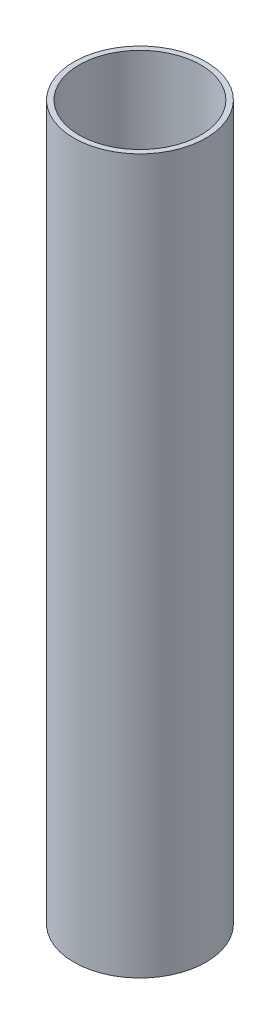
ISO-10303-21;
HEADER;
FILE_DESCRIPTION(('STEP AP214'),'2;1');
FILE_NAME('part.step','',(''),(''),'','','');
FILE_SCHEMA(('AUTOMOTIVE_DESIGN { 1 0 10303 214 1 1 1 1 }'));
ENDSEC;
DATA;
#1=APPLICATION_CONTEXT('core data for automotive mechanical design processes');
#2=APPLICATION_PROTOCOL_DEFINITION('international standard','automotive_design',2000,#1);
#3=PRODUCT_CONTEXT('',#1,'mechanical');
#4=PRODUCT('Part','Part','',(#3));
#5=PRODUCT_RELATED_PRODUCT_CATEGORY('part','',(#4));
#6=PRODUCT_DEFINITION_FORMATION('','',#4);
#7=PRODUCT_DEFINITION_CONTEXT('part definition',#1,'design');
#8=PRODUCT_DEFINITION('design','',#6,#7);
#9=PRODUCT_DEFINITION_SHAPE('','',#8);
#10=(LENGTH_UNIT() NAMED_UNIT(*) SI_UNIT(.MILLI.,.METRE.));
#11=(NAMED_UNIT(*) PLANE_ANGLE_UNIT() SI_UNIT($,.RADIAN.));
#12=(NAMED_UNIT(*) SI_UNIT($,.STERADIAN.) SOLID_ANGLE_UNIT());
#13=UNCERTAINTY_MEASURE_WITH_UNIT(LENGTH_MEASURE(1.E-05),#10,'distance_accuracy_value','');
#14=(GEOMETRIC_REPRESENTATION_CONTEXT(3) GLOBAL_UNCERTAINTY_ASSIGNED_CONTEXT((#13)) GLOBAL_UNIT_ASSIGNED_CONTEXT((#10,
#11,#12)) REPRESENTATION_CONTEXT('',''));
#15=CARTESIAN_POINT('',(0.,0.,0.));
#16=DIRECTION('',(0.,0.,1.));
#17=DIRECTION('',(1.,0.,0.));
#18=AXIS2_PLACEMENT_3D('',#15,#16,#17);
#19=CARTESIAN_POINT('',(0.,135.,0.));
#20=DIRECTION('',(0.,1.,0.));
#21=DIRECTION('',(0.,0.,1.));
#22=AXIS2_PLACEMENT_3D('',#19,#20,#21);
#23=PLANE('',#22);
#24=CARTESIAN_POINT('',(0.,135.,0.));
#25=DIRECTION('',(0.,1.,0.));
#26=DIRECTION('',(0.,0.,1.));
#27=AXIS2_PLACEMENT_3D('',#24,#25,#26);
#28=CIRCLE('',#27,12.5);
#29=CARTESIAN_POINT('',(0.,135.,12.5));
#30=VERTEX_POINT('',#29);
#31=EDGE_CURVE('E10',#30,#30,#28,.T.);
#32=ORIENTED_EDGE('',*,*,#31,.T.);
#33=EDGE_LOOP('',(#32));
#34=FACE_BOUND('',#33,.T.);
#35=CARTESIAN_POINT('',(0.,135.,0.));
#36=DIRECTION('',(0.,1.,0.));
#37=DIRECTION('',(0.,0.,1.));
#38=AXIS2_PLACEMENT_3D('',#35,#36,#37);
#39=CIRCLE('',#38,11.5);
#40=CARTESIAN_POINT('',(0.,135.,11.5));
#41=VERTEX_POINT('',#40);
#42=EDGE_CURVE('E44',#41,#41,#39,.T.);
#43=ORIENTED_EDGE('',*,*,#42,.F.);
#44=EDGE_LOOP('',(#43));
#45=FACE_BOUND('',#44,.T.);
#46=ADVANCED_FACE('F33',(#34,#45),#23,.T.);
#47=CARTESIAN_POINT('',(0.,0.,0.));
#48=DIRECTION('',(0.,1.,0.));
#49=DIRECTION('',(0.,0.,1.));
#50=AXIS2_PLACEMENT_3D('',#47,#48,#49);
#51=PLANE('',#50);
#52=CARTESIAN_POINT('',(0.,0.,0.));
#53=DIRECTION('',(0.,1.,0.));
#54=DIRECTION('',(0.,0.,1.));
#55=AXIS2_PLACEMENT_3D('',#52,#53,#54);
#56=CIRCLE('',#55,12.5);
#57=CARTESIAN_POINT('',(0.,0.,12.5));
#58=VERTEX_POINT('',#57);
#59=EDGE_CURVE('E37',#58,#58,#56,.T.);
#60=ORIENTED_EDGE('',*,*,#59,.F.);
#61=EDGE_LOOP('',(#60));
#62=FACE_BOUND('',#61,.T.);
#63=CARTESIAN_POINT('',(0.,0.,0.));
#64=DIRECTION('',(0.,1.,0.));
#65=DIRECTION('',(0.,0.,1.));
#66=AXIS2_PLACEMENT_3D('',#63,#64,#65);
#67=CIRCLE('',#66,11.5);
#68=CARTESIAN_POINT('',(0.,0.,11.5));
#69=VERTEX_POINT('',#68);
#70=EDGE_CURVE('E46',#69,#69,#67,.T.);
#71=ORIENTED_EDGE('',*,*,#70,.T.);
#72=EDGE_LOOP('',(#71));
#73=FACE_BOUND('',#72,.T.);
#74=ADVANCED_FACE('F56',(#62,#73),#51,.F.);
#75=CARTESIAN_POINT('',(0.,135.,0.));
#76=DIRECTION('',(0.,-1.,0.));
#77=DIRECTION('',(0.,0.,-1.));
#78=AXIS2_PLACEMENT_3D('',#75,#76,#77);
#79=CYLINDRICAL_SURFACE('',#78,12.5);
#80=ORIENTED_EDGE('',*,*,#31,.F.);
#81=EDGE_LOOP('',(#80));
#82=FACE_BOUND('',#81,.T.);
#83=ORIENTED_EDGE('',*,*,#59,.T.);
#84=EDGE_LOOP('',(#83));
#85=FACE_BOUND('',#84,.T.);
#86=ADVANCED_FACE('F35',(#82,#85),#79,.T.);
#87=CARTESIAN_POINT('',(0.,135.,0.));
#88=DIRECTION('',(0.,-1.,0.));
#89=DIRECTION('',(0.,0.,-1.));
#90=AXIS2_PLACEMENT_3D('',#87,#88,#89);
#91=CYLINDRICAL_SURFACE('',#90,11.5);
#92=ORIENTED_EDGE('',*,*,#42,.T.);
#93=EDGE_LOOP('',(#92));
#94=FACE_BOUND('',#93,.T.);
#95=ORIENTED_EDGE('',*,*,#70,.F.);
#96=EDGE_LOOP('',(#95));
#97=FACE_BOUND('',#96,.T.);
#98=ADVANCED_FACE('F52',(#94,#97),#91,.F.);
#99=CLOSED_SHELL('',(#46,#74,#86,#98));
#100=MANIFOLD_SOLID_BREP('B2',#99);
#101=ADVANCED_BREP_SHAPE_REPRESENTATION('',(#18,#100),#14);
#102=SHAPE_DEFINITION_REPRESENTATION(#9,#101);
ENDSEC;
END-ISO-10303-21;
